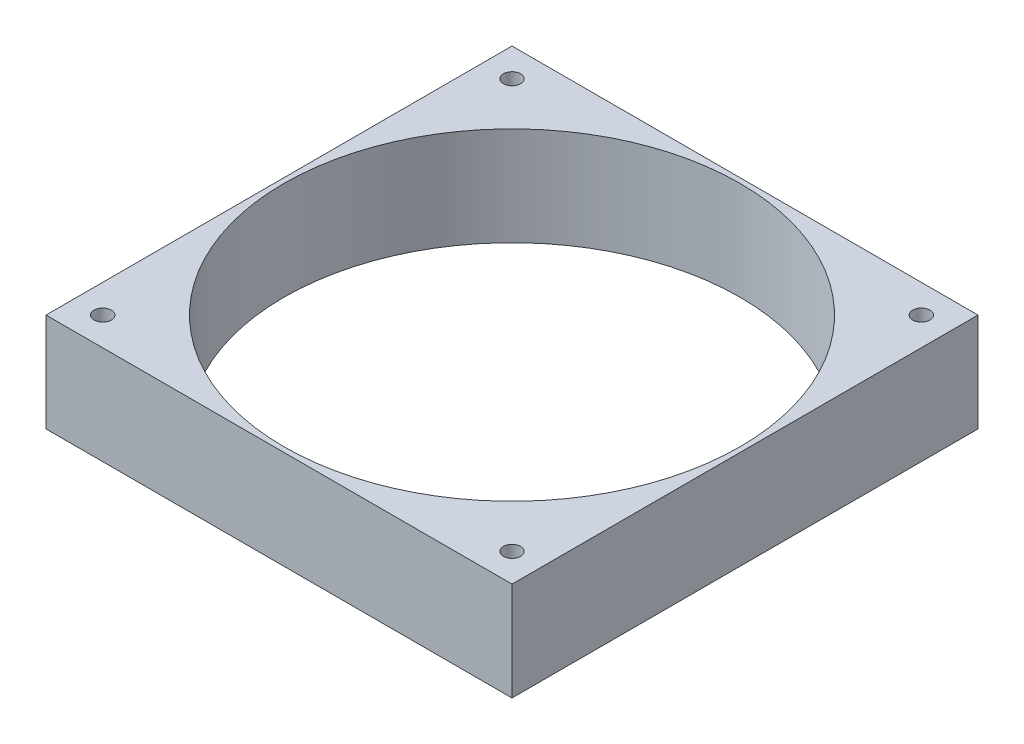
ISO-10303-21;
HEADER;
FILE_DESCRIPTION(('STEP AP214'),'2;1');
FILE_NAME('part.step','',(''),(''),'','','');
FILE_SCHEMA(('AUTOMOTIVE_DESIGN { 1 0 10303 214 1 1 1 1 }'));
ENDSEC;
DATA;
#1=APPLICATION_CONTEXT('core data for automotive mechanical design processes');
#2=APPLICATION_PROTOCOL_DEFINITION('international standard','automotive_design',2000,#1);
#3=PRODUCT_CONTEXT('',#1,'mechanical');
#4=PRODUCT('Part','Part','',(#3));
#5=PRODUCT_RELATED_PRODUCT_CATEGORY('part','',(#4));
#6=PRODUCT_DEFINITION_FORMATION('','',#4);
#7=PRODUCT_DEFINITION_CONTEXT('part definition',#1,'design');
#8=PRODUCT_DEFINITION('design','',#6,#7);
#9=PRODUCT_DEFINITION_SHAPE('','',#8);
#10=(LENGTH_UNIT() NAMED_UNIT(*) SI_UNIT(.MILLI.,.METRE.));
#11=(NAMED_UNIT(*) PLANE_ANGLE_UNIT() SI_UNIT($,.RADIAN.));
#12=(NAMED_UNIT(*) SI_UNIT($,.STERADIAN.) SOLID_ANGLE_UNIT());
#13=UNCERTAINTY_MEASURE_WITH_UNIT(LENGTH_MEASURE(1.E-05),#10,'distance_accuracy_value','');
#14=(GEOMETRIC_REPRESENTATION_CONTEXT(3) GLOBAL_UNCERTAINTY_ASSIGNED_CONTEXT((#13)) GLOBAL_UNIT_ASSIGNED_CONTEXT((#10,
#11,#12)) REPRESENTATION_CONTEXT('',''));
#15=CARTESIAN_POINT('',(0.,0.,0.));
#16=DIRECTION('',(0.,0.,1.));
#17=DIRECTION('',(1.,0.,0.));
#18=AXIS2_PLACEMENT_3D('',#15,#16,#17);
#19=CARTESIAN_POINT('',(0.,25.4,0.));
#20=DIRECTION('',(0.,-1.,0.));
#21=DIRECTION('',(0.,0.,-1.));
#22=AXIS2_PLACEMENT_3D('',#19,#20,#21);
#23=PLANE('',#22);
#24=CARTESIAN_POINT('',(0.,25.4,0.));
#25=DIRECTION('',(0.,1.,0.));
#26=DIRECTION('',(0.,0.,1.));
#27=AXIS2_PLACEMENT_3D('',#24,#25,#26);
#28=CIRCLE('',#27,58.7375);
#29=CARTESIAN_POINT('',(0.,25.4,58.7375));
#30=VERTEX_POINT('',#29);
#31=EDGE_CURVE('E166',#30,#30,#28,.T.);
#32=ORIENTED_EDGE('',*,*,#31,.F.);
#33=EDGE_LOOP('',(#32));
#34=FACE_BOUND('',#33,.T.);
#35=DIRECTION('',(0.,0.,-1.));
#36=VECTOR('',#35,1.);
#37=CARTESIAN_POINT('',(60.0075,25.4,60.0075));
#38=LINE('',#37,#36);
#39=CARTESIAN_POINT('',(60.0075,25.4,60.0075));
#40=VERTEX_POINT('',#39);
#41=CARTESIAN_POINT('',(60.0075,25.4,-60.0075));
#42=VERTEX_POINT('',#41);
#43=EDGE_CURVE('E96',#40,#42,#38,.T.);
#44=ORIENTED_EDGE('',*,*,#43,.T.);
#45=DIRECTION('',(-1.,0.,0.));
#46=VECTOR('',#45,1.);
#47=CARTESIAN_POINT('',(-60.0075,25.4,-60.0075));
#48=LINE('',#47,#46);
#49=CARTESIAN_POINT('',(-60.0075,25.4,-60.0075));
#50=VERTEX_POINT('',#49);
#51=EDGE_CURVE('E91',#42,#50,#48,.T.);
#52=ORIENTED_EDGE('',*,*,#51,.T.);
#53=DIRECTION('',(0.,0.,1.));
#54=VECTOR('',#53,1.);
#55=CARTESIAN_POINT('',(-60.0075,25.4,60.0075));
#56=LINE('',#55,#54);
#57=CARTESIAN_POINT('',(-60.0075,25.4,60.0075));
#58=VERTEX_POINT('',#57);
#59=EDGE_CURVE('E94',#50,#58,#56,.T.);
#60=ORIENTED_EDGE('',*,*,#59,.T.);
#61=DIRECTION('',(1.,0.,0.));
#62=VECTOR('',#61,1.);
#63=CARTESIAN_POINT('',(-60.0075,25.4,60.0075));
#64=LINE('',#63,#62);
#65=EDGE_CURVE('E61',#58,#40,#64,.T.);
#66=ORIENTED_EDGE('',*,*,#65,.T.);
#67=EDGE_LOOP('',(#44,#52,#60,#66));
#68=FACE_BOUND('',#67,.T.);
#69=CARTESIAN_POINT('',(-52.705,25.4,-52.705));
#70=DIRECTION('',(0.,1.,0.));
#71=DIRECTION('',(0.,0.,1.));
#72=AXIS2_PLACEMENT_3D('',#69,#70,#71);
#73=CIRCLE('',#72,2.2225);
#74=CARTESIAN_POINT('',(-52.705,25.4,-50.4825));
#75=VERTEX_POINT('',#74);
#76=EDGE_CURVE('E116',#75,#75,#73,.T.);
#77=ORIENTED_EDGE('',*,*,#76,.F.);
#78=EDGE_LOOP('',(#77));
#79=FACE_BOUND('',#78,.T.);
#80=CARTESIAN_POINT('',(52.705,25.4,52.705));
#81=DIRECTION('',(0.,1.,0.));
#82=DIRECTION('',(0.,0.,-1.));
#83=AXIS2_PLACEMENT_3D('',#80,#81,#82);
#84=CIRCLE('',#83,2.2225);
#85=CARTESIAN_POINT('',(52.705,25.4,50.4825));
#86=VERTEX_POINT('',#85);
#87=EDGE_CURVE('E138',#86,#86,#84,.T.);
#88=ORIENTED_EDGE('',*,*,#87,.F.);
#89=EDGE_LOOP('',(#88));
#90=FACE_BOUND('',#89,.T.);
#91=CARTESIAN_POINT('',(52.705,25.4,-52.705));
#92=DIRECTION('',(0.,1.,0.));
#93=DIRECTION('',(0.,0.,1.));
#94=AXIS2_PLACEMENT_3D('',#91,#92,#93);
#95=CIRCLE('',#94,2.2225);
#96=CARTESIAN_POINT('',(52.705,25.4,-50.4825));
#97=VERTEX_POINT('',#96);
#98=EDGE_CURVE('E146',#97,#97,#95,.T.);
#99=ORIENTED_EDGE('',*,*,#98,.F.);
#100=EDGE_LOOP('',(#99));
#101=FACE_BOUND('',#100,.T.);
#102=CARTESIAN_POINT('',(-52.705,25.4,52.705));
#103=DIRECTION('',(0.,1.,0.));
#104=DIRECTION('',(0.,0.,-1.));
#105=AXIS2_PLACEMENT_3D('',#102,#103,#104);
#106=CIRCLE('',#105,2.2225);
#107=CARTESIAN_POINT('',(-52.705,25.4,50.4825));
#108=VERTEX_POINT('',#107);
#109=EDGE_CURVE('E154',#108,#108,#106,.T.);
#110=ORIENTED_EDGE('',*,*,#109,.F.);
#111=EDGE_LOOP('',(#110));
#112=FACE_BOUND('',#111,.T.);
#113=ADVANCED_FACE('F43',(#34,#68,#79,#90,#101,#112),#23,.F.);
#114=CARTESIAN_POINT('',(0.,0.,0.));
#115=DIRECTION('',(0.,-1.,0.));
#116=DIRECTION('',(0.,0.,-1.));
#117=AXIS2_PLACEMENT_3D('',#114,#115,#116);
#118=PLANE('',#117);
#119=CARTESIAN_POINT('',(0.,0.,0.));
#120=DIRECTION('',(0.,1.,0.));
#121=DIRECTION('',(0.,0.,1.));
#122=AXIS2_PLACEMENT_3D('',#119,#120,#121);
#123=CIRCLE('',#122,58.7375);
#124=CARTESIAN_POINT('',(0.,0.,58.7375));
#125=VERTEX_POINT('',#124);
#126=EDGE_CURVE('E162',#125,#125,#123,.T.);
#127=ORIENTED_EDGE('',*,*,#126,.T.);
#128=EDGE_LOOP('',(#127));
#129=FACE_BOUND('',#128,.T.);
#130=CARTESIAN_POINT('',(52.705,0.,-52.705));
#131=DIRECTION('',(0.,1.,0.));
#132=DIRECTION('',(0.,0.,1.));
#133=AXIS2_PLACEMENT_3D('',#130,#131,#132);
#134=CIRCLE('',#133,2.2225);
#135=CARTESIAN_POINT('',(52.705,0.,-50.4825));
#136=VERTEX_POINT('',#135);
#137=EDGE_CURVE('E150',#136,#136,#134,.T.);
#138=ORIENTED_EDGE('',*,*,#137,.T.);
#139=EDGE_LOOP('',(#138));
#140=FACE_BOUND('',#139,.T.);
#141=CARTESIAN_POINT('',(-52.705,0.,-52.705));
#142=DIRECTION('',(0.,1.,0.));
#143=DIRECTION('',(0.,0.,1.));
#144=AXIS2_PLACEMENT_3D('',#141,#142,#143);
#145=CIRCLE('',#144,2.2225);
#146=CARTESIAN_POINT('',(-52.705,0.,-50.4825));
#147=VERTEX_POINT('',#146);
#148=EDGE_CURVE('E134',#147,#147,#145,.T.);
#149=ORIENTED_EDGE('',*,*,#148,.T.);
#150=EDGE_LOOP('',(#149));
#151=FACE_BOUND('',#150,.T.);
#152=DIRECTION('',(0.,0.,-1.));
#153=VECTOR('',#152,1.);
#154=CARTESIAN_POINT('',(60.0075,0.,60.0075));
#155=LINE('',#154,#153);
#156=CARTESIAN_POINT('',(60.0075,0.,60.0075));
#157=VERTEX_POINT('',#156);
#158=CARTESIAN_POINT('',(60.0075,0.,-60.0075));
#159=VERTEX_POINT('',#158);
#160=EDGE_CURVE('E112',#157,#159,#155,.T.);
#161=ORIENTED_EDGE('',*,*,#160,.F.);
#162=DIRECTION('',(1.,0.,0.));
#163=VECTOR('',#162,1.);
#164=CARTESIAN_POINT('',(-60.0075,0.,60.0075));
#165=LINE('',#164,#163);
#166=CARTESIAN_POINT('',(-60.0075,0.,60.0075));
#167=VERTEX_POINT('',#166);
#168=EDGE_CURVE('E84',#167,#157,#165,.T.);
#169=ORIENTED_EDGE('',*,*,#168,.F.);
#170=DIRECTION('',(0.,0.,1.));
#171=VECTOR('',#170,1.);
#172=CARTESIAN_POINT('',(-60.0075,0.,60.0075));
#173=LINE('',#172,#171);
#174=CARTESIAN_POINT('',(-60.0075,0.,-60.0075));
#175=VERTEX_POINT('',#174);
#176=EDGE_CURVE('E78',#175,#167,#173,.T.);
#177=ORIENTED_EDGE('',*,*,#176,.F.);
#178=DIRECTION('',(-1.,0.,0.));
#179=VECTOR('',#178,1.);
#180=CARTESIAN_POINT('',(-60.0075,0.,-60.0075));
#181=LINE('',#180,#179);
#182=EDGE_CURVE('E101',#159,#175,#181,.T.);
#183=ORIENTED_EDGE('',*,*,#182,.F.);
#184=EDGE_LOOP('',(#161,#169,#177,#183));
#185=FACE_BOUND('',#184,.T.);
#186=CARTESIAN_POINT('',(52.705,0.,52.705));
#187=DIRECTION('',(0.,1.,0.));
#188=DIRECTION('',(0.,0.,-1.));
#189=AXIS2_PLACEMENT_3D('',#186,#187,#188);
#190=CIRCLE('',#189,2.2225);
#191=CARTESIAN_POINT('',(52.705,0.,50.4825));
#192=VERTEX_POINT('',#191);
#193=EDGE_CURVE('E142',#192,#192,#190,.T.);
#194=ORIENTED_EDGE('',*,*,#193,.T.);
#195=EDGE_LOOP('',(#194));
#196=FACE_BOUND('',#195,.T.);
#197=CARTESIAN_POINT('',(-52.705,0.,52.705));
#198=DIRECTION('',(0.,1.,0.));
#199=DIRECTION('',(0.,0.,-1.));
#200=AXIS2_PLACEMENT_3D('',#197,#198,#199);
#201=CIRCLE('',#200,2.2225);
#202=CARTESIAN_POINT('',(-52.705,0.,50.4825));
#203=VERTEX_POINT('',#202);
#204=EDGE_CURVE('E158',#203,#203,#201,.T.);
#205=ORIENTED_EDGE('',*,*,#204,.T.);
#206=EDGE_LOOP('',(#205));
#207=FACE_BOUND('',#206,.T.);
#208=ADVANCED_FACE('F129',(#129,#140,#151,#185,#196,#207),#118,.T.);
#209=CARTESIAN_POINT('',(60.0075,25.4,60.0075));
#210=DIRECTION('',(-1.,0.,0.));
#211=DIRECTION('',(0.,0.,1.));
#212=AXIS2_PLACEMENT_3D('',#209,#210,#211);
#213=PLANE('',#212);
#214=ORIENTED_EDGE('',*,*,#160,.T.);
#215=DIRECTION('',(0.,-1.,0.));
#216=VECTOR('',#215,1.);
#217=CARTESIAN_POINT('',(60.0075,25.4,-60.0075));
#218=LINE('',#217,#216);
#219=EDGE_CURVE('E11',#42,#159,#218,.T.);
#220=ORIENTED_EDGE('',*,*,#219,.F.);
#221=ORIENTED_EDGE('',*,*,#43,.F.);
#222=DIRECTION('',(0.,-1.,0.));
#223=VECTOR('',#222,1.);
#224=CARTESIAN_POINT('',(60.0075,25.4,60.0075));
#225=LINE('',#224,#223);
#226=EDGE_CURVE('E108',#40,#157,#225,.T.);
#227=ORIENTED_EDGE('',*,*,#226,.T.);
#228=EDGE_LOOP('',(#214,#220,#221,#227));
#229=FACE_BOUND('',#228,.T.);
#230=ADVANCED_FACE('F45',(#229),#213,.F.);
#231=CARTESIAN_POINT('',(-60.0075,25.4,-60.0075));
#232=DIRECTION('',(0.,0.,1.));
#233=DIRECTION('',(1.,0.,0.));
#234=AXIS2_PLACEMENT_3D('',#231,#232,#233);
#235=PLANE('',#234);
#236=ORIENTED_EDGE('',*,*,#182,.T.);
#237=DIRECTION('',(0.,-1.,0.));
#238=VECTOR('',#237,1.);
#239=CARTESIAN_POINT('',(-60.0075,25.4,-60.0075));
#240=LINE('',#239,#238);
#241=EDGE_CURVE('E53',#50,#175,#240,.T.);
#242=ORIENTED_EDGE('',*,*,#241,.F.);
#243=ORIENTED_EDGE('',*,*,#51,.F.);
#244=ORIENTED_EDGE('',*,*,#219,.T.);
#245=EDGE_LOOP('',(#236,#242,#243,#244));
#246=FACE_BOUND('',#245,.T.);
#247=ADVANCED_FACE('F100',(#246),#235,.F.);
#248=CARTESIAN_POINT('',(-60.0075,25.4,60.0075));
#249=DIRECTION('',(1.,0.,0.));
#250=DIRECTION('',(0.,0.,-1.));
#251=AXIS2_PLACEMENT_3D('',#248,#249,#250);
#252=PLANE('',#251);
#253=ORIENTED_EDGE('',*,*,#176,.T.);
#254=DIRECTION('',(0.,-1.,0.));
#255=VECTOR('',#254,1.);
#256=CARTESIAN_POINT('',(-60.0075,25.4,60.0075));
#257=LINE('',#256,#255);
#258=EDGE_CURVE('E103',#58,#167,#257,.T.);
#259=ORIENTED_EDGE('',*,*,#258,.F.);
#260=ORIENTED_EDGE('',*,*,#59,.F.);
#261=ORIENTED_EDGE('',*,*,#241,.T.);
#262=EDGE_LOOP('',(#253,#259,#260,#261));
#263=FACE_BOUND('',#262,.T.);
#264=ADVANCED_FACE('F104',(#263),#252,.F.);
#265=CARTESIAN_POINT('',(-60.0075,25.4,60.0075));
#266=DIRECTION('',(0.,0.,-1.));
#267=DIRECTION('',(-1.,0.,0.));
#268=AXIS2_PLACEMENT_3D('',#265,#266,#267);
#269=PLANE('',#268);
#270=ORIENTED_EDGE('',*,*,#168,.T.);
#271=ORIENTED_EDGE('',*,*,#226,.F.);
#272=ORIENTED_EDGE('',*,*,#65,.F.);
#273=ORIENTED_EDGE('',*,*,#258,.T.);
#274=EDGE_LOOP('',(#270,#271,#272,#273));
#275=FACE_BOUND('',#274,.T.);
#276=ADVANCED_FACE('F126',(#275),#269,.F.);
#277=CARTESIAN_POINT('',(-52.705,25.4,-52.705));
#278=DIRECTION('',(0.,-1.,0.));
#279=DIRECTION('',(0.,0.,-1.));
#280=AXIS2_PLACEMENT_3D('',#277,#278,#279);
#281=CYLINDRICAL_SURFACE('',#280,2.2225);
#282=ORIENTED_EDGE('',*,*,#76,.T.);
#283=EDGE_LOOP('',(#282));
#284=FACE_BOUND('',#283,.T.);
#285=ORIENTED_EDGE('',*,*,#148,.F.);
#286=EDGE_LOOP('',(#285));
#287=FACE_BOUND('',#286,.T.);
#288=ADVANCED_FACE('F190',(#284,#287),#281,.F.);
#289=CARTESIAN_POINT('',(52.705,25.4,52.705));
#290=DIRECTION('',(0.,-1.,0.));
#291=DIRECTION('',(0.,0.,-1.));
#292=AXIS2_PLACEMENT_3D('',#289,#290,#291);
#293=CYLINDRICAL_SURFACE('',#292,2.2225);
#294=ORIENTED_EDGE('',*,*,#87,.T.);
#295=EDGE_LOOP('',(#294));
#296=FACE_BOUND('',#295,.T.);
#297=ORIENTED_EDGE('',*,*,#193,.F.);
#298=EDGE_LOOP('',(#297));
#299=FACE_BOUND('',#298,.T.);
#300=ADVANCED_FACE('F232',(#296,#299),#293,.F.);
#301=CARTESIAN_POINT('',(52.705,25.4,-52.705));
#302=DIRECTION('',(0.,-1.,0.));
#303=DIRECTION('',(0.,0.,-1.));
#304=AXIS2_PLACEMENT_3D('',#301,#302,#303);
#305=CYLINDRICAL_SURFACE('',#304,2.2225);
#306=ORIENTED_EDGE('',*,*,#98,.T.);
#307=EDGE_LOOP('',(#306));
#308=FACE_BOUND('',#307,.T.);
#309=ORIENTED_EDGE('',*,*,#137,.F.);
#310=EDGE_LOOP('',(#309));
#311=FACE_BOUND('',#310,.T.);
#312=ADVANCED_FACE('F225',(#308,#311),#305,.F.);
#313=CARTESIAN_POINT('',(-52.705,25.4,52.705));
#314=DIRECTION('',(0.,-1.,0.));
#315=DIRECTION('',(0.,0.,-1.));
#316=AXIS2_PLACEMENT_3D('',#313,#314,#315);
#317=CYLINDRICAL_SURFACE('',#316,2.2225);
#318=ORIENTED_EDGE('',*,*,#109,.T.);
#319=EDGE_LOOP('',(#318));
#320=FACE_BOUND('',#319,.T.);
#321=ORIENTED_EDGE('',*,*,#204,.F.);
#322=EDGE_LOOP('',(#321));
#323=FACE_BOUND('',#322,.T.);
#324=ADVANCED_FACE('F179',(#320,#323),#317,.F.);
#325=CARTESIAN_POINT('',(0.,0.,0.));
#326=DIRECTION('',(0.,1.,0.));
#327=DIRECTION('',(0.,0.,1.));
#328=AXIS2_PLACEMENT_3D('',#325,#326,#327);
#329=CYLINDRICAL_SURFACE('',#328,58.7375);
#330=ORIENTED_EDGE('',*,*,#126,.F.);
#331=EDGE_LOOP('',(#330));
#332=FACE_BOUND('',#331,.T.);
#333=ORIENTED_EDGE('',*,*,#31,.T.);
#334=EDGE_LOOP('',(#333));
#335=FACE_BOUND('',#334,.T.);
#336=ADVANCED_FACE('F176',(#332,#335),#329,.F.);
#337=CLOSED_SHELL('',(#113,#208,#230,#247,#264,#276,#288,#300,#312,#324,#336));
#338=MANIFOLD_SOLID_BREP('B2',#337);
#339=ADVANCED_BREP_SHAPE_REPRESENTATION('',(#18,#338),#14);
#340=SHAPE_DEFINITION_REPRESENTATION(#9,#339);
ENDSEC;
END-ISO-10303-21;
